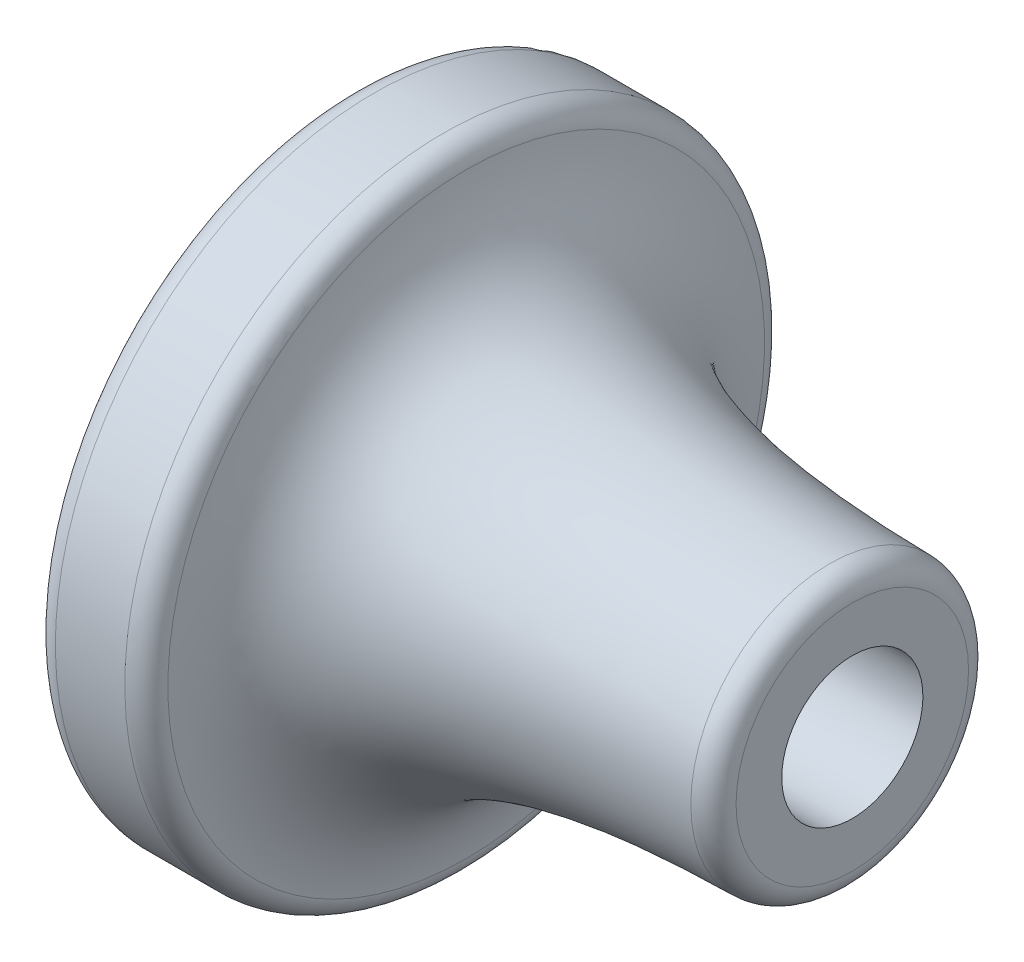
ISO-10303-21;
HEADER;
FILE_DESCRIPTION(('STEP AP214'),'2;1');
FILE_NAME('part.step','',(''),(''),'','','');
FILE_SCHEMA(('AUTOMOTIVE_DESIGN { 1 0 10303 214 1 1 1 1 }'));
ENDSEC;
DATA;
#1=APPLICATION_CONTEXT('core data for automotive mechanical design processes');
#2=APPLICATION_PROTOCOL_DEFINITION('international standard','automotive_design',2000,#1);
#3=PRODUCT_CONTEXT('',#1,'mechanical');
#4=PRODUCT('Part','Part','',(#3));
#5=PRODUCT_RELATED_PRODUCT_CATEGORY('part','',(#4));
#6=PRODUCT_DEFINITION_FORMATION('','',#4);
#7=PRODUCT_DEFINITION_CONTEXT('part definition',#1,'design');
#8=PRODUCT_DEFINITION('design','',#6,#7);
#9=PRODUCT_DEFINITION_SHAPE('','',#8);
#10=(LENGTH_UNIT() NAMED_UNIT(*) SI_UNIT(.MILLI.,.METRE.));
#11=(NAMED_UNIT(*) PLANE_ANGLE_UNIT() SI_UNIT($,.RADIAN.));
#12=(NAMED_UNIT(*) SI_UNIT($,.STERADIAN.) SOLID_ANGLE_UNIT());
#13=UNCERTAINTY_MEASURE_WITH_UNIT(LENGTH_MEASURE(1.E-05),#10,'distance_accuracy_value','');
#14=(GEOMETRIC_REPRESENTATION_CONTEXT(3) GLOBAL_UNCERTAINTY_ASSIGNED_CONTEXT((#13)) GLOBAL_UNIT_ASSIGNED_CONTEXT((#10,
#11,#12)) REPRESENTATION_CONTEXT('',''));
#15=CARTESIAN_POINT('',(0.,0.,0.));
#16=DIRECTION('',(0.,0.,1.));
#17=DIRECTION('',(1.,0.,0.));
#18=AXIS2_PLACEMENT_3D('',#15,#16,#17);
#19=CARTESIAN_POINT('',(-8.,0.,0.));
#20=DIRECTION('',(-1.,0.,0.));
#21=DIRECTION('',(0.,-1.,0.));
#22=AXIS2_PLACEMENT_3D('',#19,#20,#21);
#23=PLANE('',#22);
#24=CARTESIAN_POINT('',(-8.,0.,0.));
#25=DIRECTION('',(-1.,0.,0.));
#26=DIRECTION('',(0.,-1.,0.));
#27=AXIS2_PLACEMENT_3D('',#24,#25,#26);
#28=CIRCLE('',#27,13.);
#29=CARTESIAN_POINT('',(-8.,-13.,0.));
#30=VERTEX_POINT('',#29);
#31=EDGE_CURVE('E49',#30,#30,#28,.T.);
#32=ORIENTED_EDGE('',*,*,#31,.T.);
#33=EDGE_LOOP('',(#32));
#34=FACE_BOUND('',#33,.T.);
#35=ADVANCED_FACE('F34',(#34),#23,.T.);
#36=CARTESIAN_POINT('',(0.,0.,0.));
#37=DIRECTION('',(1.,0.,0.));
#38=DIRECTION('',(0.,1.,0.));
#39=AXIS2_PLACEMENT_3D('',#36,#37,#38);
#40=CYLINDRICAL_SURFACE('',#39,14.);
#41=CARTESIAN_POINT('',(-7.,0.,0.));
#42=DIRECTION('',(-1.,0.,0.));
#43=DIRECTION('',(0.,-1.,0.));
#44=AXIS2_PLACEMENT_3D('',#41,#42,#43);
#45=CIRCLE('',#44,14.);
#46=CARTESIAN_POINT('',(-7.,-14.,0.));
#47=VERTEX_POINT('',#46);
#48=EDGE_CURVE('E54',#47,#47,#45,.F.);
#49=ORIENTED_EDGE('',*,*,#48,.T.);
#50=EDGE_LOOP('',(#49));
#51=FACE_BOUND('',#50,.T.);
#52=CARTESIAN_POINT('',(-3.95092088721815,0.,0.));
#53=DIRECTION('',(-1.,0.,0.));
#54=DIRECTION('',(0.,-1.,0.));
#55=AXIS2_PLACEMENT_3D('',#52,#53,#54);
#56=CIRCLE('',#55,14.);
#57=CARTESIAN_POINT('',(-3.95092088721815,-14.,0.));
#58=VERTEX_POINT('',#57);
#59=EDGE_CURVE('E57',#58,#58,#56,.T.);
#60=ORIENTED_EDGE('',*,*,#59,.T.);
#61=EDGE_LOOP('',(#60));
#62=FACE_BOUND('',#61,.T.);
#63=ADVANCED_FACE('F78',(#51,#62),#40,.T.);
#64=CARTESIAN_POINT('',(14.0000000000001,6.1,0.));
#65=CARTESIAN_POINT('',(0.961422574974385,6.1,0.));
#66=CARTESIAN_POINT('',(-3.,8.86736901421736,0.));
#67=CARTESIAN_POINT('',(-3.,14.,0.));
#68=B_SPLINE_CURVE_WITH_KNOTS('',3,(#64,#65,#66,#67),.UNSPECIFIED.,.F.,.F.,(4,4),(0.,1.),.UNSPECIFIED.);
#69=CARTESIAN_POINT('',(0.,0.,0.));
#70=DIRECTION('',(1.,0.,0.));
#71=AXIS1_PLACEMENT('',#69,#70);
#72=SURFACE_OF_REVOLUTION('',#68,#71);
#73=CARTESIAN_POINT('',(-2.95607407528896,0.,0.));
#74=DIRECTION('',(1.,0.,0.));
#75=DIRECTION('',(0.,1.,0.));
#76=AXIS2_PLACEMENT_3D('',#73,#74,#75);
#77=CIRCLE('',#76,13.1013894510998);
#78=CARTESIAN_POINT('',(-2.95607407528896,13.1013894510998,0.));
#79=VERTEX_POINT('',#78);
#80=EDGE_CURVE('E41',#79,#79,#77,.T.);
#81=ORIENTED_EDGE('',*,*,#80,.T.);
#82=EDGE_LOOP('',(#81));
#83=FACE_BOUND('',#82,.T.);
#84=CARTESIAN_POINT('',(13.0113052600681,0.,0.));
#85=DIRECTION('',(1.,0.,0.));
#86=DIRECTION('',(0.,1.,0.));
#87=AXIS2_PLACEMENT_3D('',#84,#85,#86);
#88=CIRCLE('',#87,6.10549154301063);
#89=CARTESIAN_POINT('',(13.0113052600681,6.10549154301063,0.));
#90=VERTEX_POINT('',#89);
#91=EDGE_CURVE('E45',#90,#90,#88,.F.);
#92=ORIENTED_EDGE('',*,*,#91,.T.);
#93=EDGE_LOOP('',(#92));
#94=FACE_BOUND('',#93,.T.);
#95=ADVANCED_FACE('F73',(#83,#94),#72,.F.);
#96=CARTESIAN_POINT('',(14.,3.1,0.));
#97=DIRECTION('',(1.,0.,0.));
#98=DIRECTION('',(0.,1.,0.));
#99=AXIS2_PLACEMENT_3D('',#96,#97,#98);
#100=PLANE('',#99);
#101=CARTESIAN_POINT('',(14.,0.,0.));
#102=DIRECTION('',(1.,0.,0.));
#103=DIRECTION('',(0.,1.,0.));
#104=AXIS2_PLACEMENT_3D('',#101,#102,#103);
#105=CIRCLE('',#104,5.10555544950526);
#106=CARTESIAN_POINT('',(14.,5.10555544950526,0.));
#107=VERTEX_POINT('',#106);
#108=EDGE_CURVE('E10',#107,#107,#105,.T.);
#109=ORIENTED_EDGE('',*,*,#108,.T.);
#110=EDGE_LOOP('',(#109));
#111=FACE_BOUND('',#110,.T.);
#112=CARTESIAN_POINT('',(14.,0.,0.));
#113=DIRECTION('',(1.,0.,0.));
#114=DIRECTION('',(0.,1.,0.));
#115=AXIS2_PLACEMENT_3D('',#112,#113,#114);
#116=CIRCLE('',#115,3.1);
#117=CARTESIAN_POINT('',(14.,3.1,0.));
#118=VERTEX_POINT('',#117);
#119=EDGE_CURVE('E60',#118,#118,#116,.T.);
#120=ORIENTED_EDGE('',*,*,#119,.F.);
#121=EDGE_LOOP('',(#120));
#122=FACE_BOUND('',#121,.T.);
#123=ADVANCED_FACE('F77',(#111,#122),#100,.T.);
#124=CARTESIAN_POINT('',(0.,0.,0.));
#125=DIRECTION('',(1.,0.,0.));
#126=DIRECTION('',(0.,1.,0.));
#127=AXIS2_PLACEMENT_3D('',#124,#125,#126);
#128=CYLINDRICAL_SURFACE('',#127,3.1);
#129=ORIENTED_EDGE('',*,*,#119,.T.);
#130=EDGE_LOOP('',(#129));
#131=FACE_BOUND('',#130,.T.);
#132=CARTESIAN_POINT('',(0.,0.,0.));
#133=DIRECTION('',(1.,0.,0.));
#134=DIRECTION('',(0.,1.,0.));
#135=AXIS2_PLACEMENT_3D('',#132,#133,#134);
#136=CIRCLE('',#135,3.1);
#137=CARTESIAN_POINT('',(0.,3.1,0.));
#138=VERTEX_POINT('',#137);
#139=EDGE_CURVE('E63',#138,#138,#136,.T.);
#140=ORIENTED_EDGE('',*,*,#139,.F.);
#141=EDGE_LOOP('',(#140));
#142=FACE_BOUND('',#141,.T.);
#143=ADVANCED_FACE('F129',(#131,#142),#128,.F.);
#144=CARTESIAN_POINT('',(0.,0.,0.));
#145=DIRECTION('',(1.,0.,0.));
#146=DIRECTION('',(0.,1.,0.));
#147=AXIS2_PLACEMENT_3D('',#144,#145,#146);
#148=PLANE('',#147);
#149=ORIENTED_EDGE('',*,*,#139,.T.);
#150=EDGE_LOOP('',(#149));
#151=FACE_BOUND('',#150,.T.);
#152=ADVANCED_FACE('F89',(#151),#148,.T.);
#153=CARTESIAN_POINT('',(-7.,0.,0.));
#154=DIRECTION('',(-1.,0.,0.));
#155=DIRECTION('',(0.,-1.,0.));
#156=AXIS2_PLACEMENT_3D('',#153,#154,#155);
#157=TOROIDAL_SURFACE('',#156,13.,1.);
#158=ORIENTED_EDGE('',*,*,#31,.F.);
#159=EDGE_LOOP('',(#158));
#160=FACE_BOUND('',#159,.T.);
#161=ORIENTED_EDGE('',*,*,#48,.F.);
#162=EDGE_LOOP('',(#161));
#163=FACE_BOUND('',#162,.T.);
#164=ADVANCED_FACE('F86',(#160,#163),#157,.T.);
#165=CARTESIAN_POINT('',(-3.95092088721815,0.,0.));
#166=DIRECTION('',(-1.,0.,0.));
#167=DIRECTION('',(0.,-1.,0.));
#168=AXIS2_PLACEMENT_3D('',#165,#166,#167);
#169=TOROIDAL_SURFACE('',#168,13.,1.);
#170=ORIENTED_EDGE('',*,*,#59,.F.);
#171=EDGE_LOOP('',(#170));
#172=FACE_BOUND('',#171,.T.);
#173=ORIENTED_EDGE('',*,*,#80,.F.);
#174=EDGE_LOOP('',(#173));
#175=FACE_BOUND('',#174,.T.);
#176=ADVANCED_FACE('F88',(#172,#175),#169,.T.);
#177=CARTESIAN_POINT('',(13.,0.,0.));
#178=DIRECTION('',(1.,0.,0.));
#179=DIRECTION('',(0.,1.,0.));
#180=AXIS2_PLACEMENT_3D('',#177,#178,#179);
#181=TOROIDAL_SURFACE('',#180,5.10555544950526,1.);
#182=ORIENTED_EDGE('',*,*,#91,.F.);
#183=EDGE_LOOP('',(#182));
#184=FACE_BOUND('',#183,.T.);
#185=ORIENTED_EDGE('',*,*,#108,.F.);
#186=EDGE_LOOP('',(#185));
#187=FACE_BOUND('',#186,.T.);
#188=ADVANCED_FACE('F36',(#184,#187),#181,.T.);
#189=CLOSED_SHELL('',(#35,#63,#95,#123,#143,#152,#164,#176,#188));
#190=MANIFOLD_SOLID_BREP('B2',#189);
#191=ADVANCED_BREP_SHAPE_REPRESENTATION('',(#18,#190),#14);
#192=SHAPE_DEFINITION_REPRESENTATION(#9,#191);
ENDSEC;
END-ISO-10303-21;
